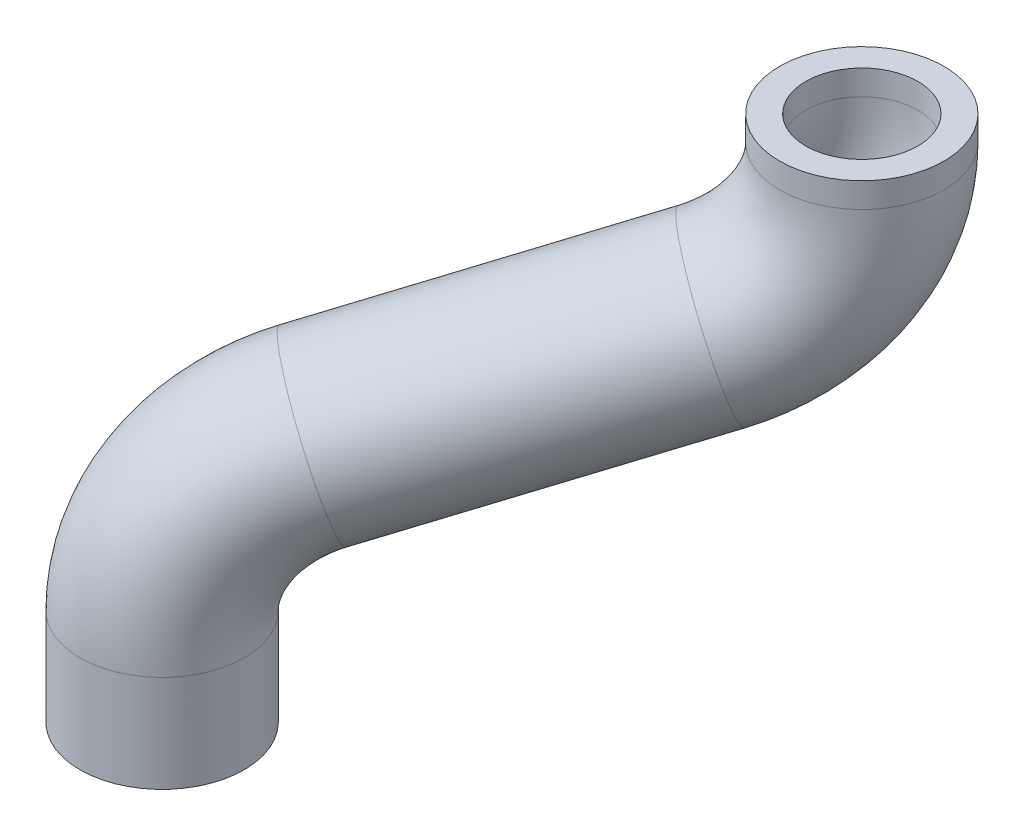
ISO-10303-21;
HEADER;
FILE_DESCRIPTION(('STEP AP214'),'2;1');
FILE_NAME('part.step','',(''),(''),'','','');
FILE_SCHEMA(('AUTOMOTIVE_DESIGN { 1 0 10303 214 1 1 1 1 }'));
ENDSEC;
DATA;
#1=APPLICATION_CONTEXT('core data for automotive mechanical design processes');
#2=APPLICATION_PROTOCOL_DEFINITION('international standard','automotive_design',2000,#1);
#3=PRODUCT_CONTEXT('',#1,'mechanical');
#4=PRODUCT('Part','Part','',(#3));
#5=PRODUCT_RELATED_PRODUCT_CATEGORY('part','',(#4));
#6=PRODUCT_DEFINITION_FORMATION('','',#4);
#7=PRODUCT_DEFINITION_CONTEXT('part definition',#1,'design');
#8=PRODUCT_DEFINITION('design','',#6,#7);
#9=PRODUCT_DEFINITION_SHAPE('','',#8);
#10=(LENGTH_UNIT() NAMED_UNIT(*) SI_UNIT(.MILLI.,.METRE.));
#11=(NAMED_UNIT(*) PLANE_ANGLE_UNIT() SI_UNIT($,.RADIAN.));
#12=(NAMED_UNIT(*) SI_UNIT($,.STERADIAN.) SOLID_ANGLE_UNIT());
#13=UNCERTAINTY_MEASURE_WITH_UNIT(LENGTH_MEASURE(1.E-05),#10,'distance_accuracy_value','');
#14=(GEOMETRIC_REPRESENTATION_CONTEXT(3) GLOBAL_UNCERTAINTY_ASSIGNED_CONTEXT((#13)) GLOBAL_UNIT_ASSIGNED_CONTEXT((#10,
#11,#12)) REPRESENTATION_CONTEXT('',''));
#15=CARTESIAN_POINT('',(0.,0.,0.));
#16=DIRECTION('',(0.,0.,1.));
#17=DIRECTION('',(1.,0.,0.));
#18=AXIS2_PLACEMENT_3D('',#15,#16,#17);
#19=CARTESIAN_POINT('',(-278.808582713209,47.6944504142142,105.885812846639));
#20=DIRECTION('',(0.,1.,0.));
#21=DIRECTION('',(0.,0.,1.));
#22=AXIS2_PLACEMENT_3D('',#19,#20,#21);
#23=CYLINDRICAL_SURFACE('',#22,11.);
#24=CARTESIAN_POINT('',(-278.808582713209,60.6776060962734,105.885812846639));
#25=DIRECTION('',(0.,1.,0.));
#26=DIRECTION('',(0.,0.,1.));
#27=AXIS2_PLACEMENT_3D('',#24,#25,#26);
#28=CIRCLE('',#27,11.);
#29=CARTESIAN_POINT('',(-285.951248603986,60.6776060962734,114.251356700611));
#30=VERTEX_POINT('',#29);
#31=EDGE_CURVE('E56',#30,#30,#28,.T.);
#32=ORIENTED_EDGE('',*,*,#31,.F.);
#33=EDGE_LOOP('',(#32));
#34=FACE_BOUND('',#33,.T.);
#35=CARTESIAN_POINT('',(-278.808582713209,47.6944504142142,105.885812846639));
#36=DIRECTION('',(0.,1.,0.));
#37=DIRECTION('',(0.,0.,1.));
#38=AXIS2_PLACEMENT_3D('',#35,#36,#37);
#39=CIRCLE('',#38,11.);
#40=CARTESIAN_POINT('',(-278.808582713209,47.6944504142142,116.885812846639));
#41=VERTEX_POINT('',#40);
#42=EDGE_CURVE('E53',#41,#41,#39,.T.);
#43=ORIENTED_EDGE('',*,*,#42,.T.);
#44=EDGE_LOOP('',(#43));
#45=FACE_BOUND('',#44,.T.);
#46=ADVANCED_FACE('F32',(#34,#45),#23,.T.);
#47=CARTESIAN_POINT('',(-265.614130813156,60.6776060962734,90.4323718363923));
#48=DIRECTION('',(-0.760503986724747,0.,-0.649333262797899));
#49=DIRECTION('',(-0.649333262797899,0.,0.760503986724747));
#50=AXIS2_PLACEMENT_3D('',#47,#48,#49);
#51=TOROIDAL_SURFACE('',#50,20.32,11.);
#52=CARTESIAN_POINT('',(-269.523012131986,80.0854381614537,95.0104829496204));
#53=DIRECTION('',(0.620184592456557,0.296251890449026,-0.72636484543573));
#54=DIRECTION('',(0.347525268013519,0.72636484543573,0.59297580001823));
#55=AXIS2_PLACEMENT_3D('',#52,#53,#54);
#56=CIRCLE('',#55,11.);
#57=CARTESIAN_POINT('',(-271.639040404974,90.5916464644549,97.4887911309939));
#58=VERTEX_POINT('',#57);
#59=EDGE_CURVE('E59',#58,#58,#56,.T.);
#60=CARTESIAN_POINT('',(-265.614130813156,60.6776060962734,90.4323718363923));
#61=DIRECTION('',(-0.760503986724747,0.,-0.649333262797899));
#62=DIRECTION('',(-0.649333262797899,0.,0.760503986724747));
#63=AXIS2_PLACEMENT_3D('',#60,#61,#62);
#64=CIRCLE('',#63,31.32);
#65=EDGE_CURVE('',#30,#58,#64,.T.);
#66=ORIENTED_EDGE('',*,*,#31,.T.);
#67=ORIENTED_EDGE('',*,*,#59,.F.);
#68=ORIENTED_EDGE('',*,*,#65,.T.);
#69=ORIENTED_EDGE('',*,*,#65,.F.);
#70=EDGE_LOOP('',(#66,#68,#67,#69));
#71=FACE_BOUND('',#70,.T.);
#72=ADVANCED_FACE('F78',(#71),#51,.T.);
#73=CARTESIAN_POINT('',(-269.523012131986,80.0854381614537,95.0104829496204));
#74=DIRECTION('',(0.620184592456559,0.296251890449025,-0.726364845435729));
#75=DIRECTION('',(-0.760503986724746,0.,-0.649333262797901));
#76=AXIS2_PLACEMENT_3D('',#73,#74,#75);
#77=CYLINDRICAL_SURFACE('',#76,11.);
#78=CARTESIAN_POINT('',(-244.950027579798,91.8235451962077,66.2304191698277));
#79=DIRECTION('',(0.620184592456559,0.296251890449025,-0.726364845435729));
#80=DIRECTION('',(0.347525268013519,0.72636484543573,0.59297580001823));
#81=AXIS2_PLACEMENT_3D('',#78,#79,#80);
#82=CIRCLE('',#81,11.);
#83=CARTESIAN_POINT('',(-242.833999306809,81.3173368932065,63.7521109884542));
#84=VERTEX_POINT('',#83);
#85=EDGE_CURVE('E61',#84,#84,#82,.T.);
#86=ORIENTED_EDGE('',*,*,#85,.F.);
#87=EDGE_LOOP('',(#86));
#88=FACE_BOUND('',#87,.T.);
#89=ORIENTED_EDGE('',*,*,#59,.T.);
#90=EDGE_LOOP('',(#89));
#91=FACE_BOUND('',#90,.T.);
#92=ADVANCED_FACE('F71',(#88,#91),#77,.T.);
#93=CARTESIAN_POINT('',(-248.858908898627,111.231377261388,70.8085302830558));
#94=DIRECTION('',(0.760503986724746,0.,0.649333262797901));
#95=DIRECTION('',(0.649333262797901,0.,-0.760503986724746));
#96=AXIS2_PLACEMENT_3D('',#93,#94,#95);
#97=TOROIDAL_SURFACE('',#96,20.32,11.);
#98=CARTESIAN_POINT('',(-235.664456998574,111.231377261388,55.3550892728094));
#99=DIRECTION('',(0.,1.,0.));
#100=DIRECTION('',(0.,0.,1.));
#101=AXIS2_PLACEMENT_3D('',#98,#99,#100);
#102=CIRCLE('',#101,11.);
#103=CARTESIAN_POINT('',(-228.521791107796,111.231377261388,46.9895454188372));
#104=VERTEX_POINT('',#103);
#105=EDGE_CURVE('E36',#104,#104,#102,.T.);
#106=CARTESIAN_POINT('',(-248.858908898627,111.231377261388,70.8085302830558));
#107=DIRECTION('',(0.760503986724746,0.,0.649333262797901));
#108=DIRECTION('',(0.649333262797901,0.,-0.760503986724746));
#109=AXIS2_PLACEMENT_3D('',#106,#107,#108);
#110=CIRCLE('',#109,31.32);
#111=EDGE_CURVE('',#84,#104,#110,.T.);
#112=ORIENTED_EDGE('',*,*,#85,.T.);
#113=ORIENTED_EDGE('',*,*,#105,.F.);
#114=ORIENTED_EDGE('',*,*,#111,.T.);
#115=ORIENTED_EDGE('',*,*,#111,.F.);
#116=EDGE_LOOP('',(#112,#114,#113,#115));
#117=FACE_BOUND('',#116,.T.);
#118=ADVANCED_FACE('F69',(#117),#97,.T.);
#119=CARTESIAN_POINT('',(-235.664456998574,111.231377261388,55.3550892728094));
#120=DIRECTION('',(0.,1.,0.));
#121=DIRECTION('',(0.,0.,1.));
#122=AXIS2_PLACEMENT_3D('',#119,#120,#121);
#123=CYLINDRICAL_SURFACE('',#122,11.);
#124=CARTESIAN_POINT('',(-235.664456998574,114.569170273835,55.3550892728094));
#125=DIRECTION('',(0.,1.,0.));
#126=DIRECTION('',(0.,0.,1.));
#127=AXIS2_PLACEMENT_3D('',#124,#125,#126);
#128=CIRCLE('',#127,11.);
#129=CARTESIAN_POINT('',(-235.664456998574,114.569170273835,66.3550892728094));
#130=VERTEX_POINT('',#129);
#131=EDGE_CURVE('E49',#130,#130,#128,.T.);
#132=ORIENTED_EDGE('',*,*,#131,.F.);
#133=EDGE_LOOP('',(#132));
#134=FACE_BOUND('',#133,.T.);
#135=ORIENTED_EDGE('',*,*,#105,.T.);
#136=EDGE_LOOP('',(#135));
#137=FACE_BOUND('',#136,.T.);
#138=ADVANCED_FACE('F34',(#134,#137),#123,.T.);
#139=CARTESIAN_POINT('',(-278.808582713209,47.6944504142142,105.885812846639));
#140=DIRECTION('',(0.,1.,0.));
#141=DIRECTION('',(0.,0.,1.));
#142=AXIS2_PLACEMENT_3D('',#139,#140,#141);
#143=PLANE('',#142);
#144=CARTESIAN_POINT('',(-278.808582713209,47.6944504142142,105.885812846639));
#145=DIRECTION('',(0.,1.,0.));
#146=DIRECTION('',(0.,0.,1.));
#147=AXIS2_PLACEMENT_3D('',#144,#145,#146);
#148=CIRCLE('',#147,7.50000000000001);
#149=CARTESIAN_POINT('',(-278.808582713209,47.6944504142142,113.385812846639));
#150=VERTEX_POINT('',#149);
#151=EDGE_CURVE('E52',#150,#150,#148,.F.);
#152=ORIENTED_EDGE('',*,*,#151,.F.);
#153=EDGE_LOOP('',(#152));
#154=FACE_BOUND('',#153,.T.);
#155=ORIENTED_EDGE('',*,*,#42,.F.);
#156=EDGE_LOOP('',(#155));
#157=FACE_BOUND('',#156,.T.);
#158=ADVANCED_FACE('F76',(#154,#157),#143,.F.);
#159=CARTESIAN_POINT('',(-235.664456998574,114.569170273835,55.3550892728094));
#160=DIRECTION('',(0.,1.,0.));
#161=DIRECTION('',(0.,0.,1.));
#162=AXIS2_PLACEMENT_3D('',#159,#160,#161);
#163=PLANE('',#162);
#164=CARTESIAN_POINT('',(-235.664456998574,114.569170273835,55.3550892728094));
#165=DIRECTION('',(0.,1.,0.));
#166=DIRECTION('',(0.,0.,1.));
#167=AXIS2_PLACEMENT_3D('',#164,#165,#166);
#168=CIRCLE('',#167,7.50000000000001);
#169=CARTESIAN_POINT('',(-235.664456998574,114.569170273835,62.8550892728094));
#170=VERTEX_POINT('',#169);
#171=EDGE_CURVE('E10',#170,#170,#168,.F.);
#172=ORIENTED_EDGE('',*,*,#171,.T.);
#173=EDGE_LOOP('',(#172));
#174=FACE_BOUND('',#173,.T.);
#175=ORIENTED_EDGE('',*,*,#131,.T.);
#176=EDGE_LOOP('',(#175));
#177=FACE_BOUND('',#176,.T.);
#178=ADVANCED_FACE('F95',(#174,#177),#163,.T.);
#179=CARTESIAN_POINT('',(-278.808582713209,47.6944504142142,105.885812846639));
#180=DIRECTION('',(0.,1.,0.));
#181=DIRECTION('',(0.,0.,1.));
#182=AXIS2_PLACEMENT_3D('',#179,#180,#181);
#183=CYLINDRICAL_SURFACE('',#182,7.50000000000001);
#184=CARTESIAN_POINT('',(-278.808582713209,60.6776060962734,105.885812846639));
#185=DIRECTION('',(0.,1.,0.));
#186=DIRECTION('',(0.,0.,1.));
#187=AXIS2_PLACEMENT_3D('',#184,#185,#186);
#188=CIRCLE('',#187,7.50000000000001);
#189=CARTESIAN_POINT('',(-283.678582184194,60.6776060962734,111.589592747075));
#190=VERTEX_POINT('',#189);
#191=EDGE_CURVE('E191',#190,#190,#188,.F.);
#192=ORIENTED_EDGE('',*,*,#191,.F.);
#193=EDGE_LOOP('',(#192));
#194=FACE_BOUND('',#193,.T.);
#195=ORIENTED_EDGE('',*,*,#151,.T.);
#196=EDGE_LOOP('',(#195));
#197=FACE_BOUND('',#196,.T.);
#198=ADVANCED_FACE('F98',(#194,#197),#183,.F.);
#199=CARTESIAN_POINT('',(-265.614130813156,60.6776060962734,90.4323718363923));
#200=DIRECTION('',(-0.760503986724747,0.,-0.649333262797899));
#201=DIRECTION('',(-0.649333262797899,0.,0.760503986724747));
#202=AXIS2_PLACEMENT_3D('',#199,#200,#201);
#203=TOROIDAL_SURFACE('',#202,20.32,7.50000000000001);
#204=CARTESIAN_POINT('',(-269.523012131986,80.0854381614537,95.0104829496204));
#205=DIRECTION('',(0.620184592456557,0.296251890449026,-0.72636484543573));
#206=DIRECTION('',(0.347525268013519,0.72636484543573,0.59297580001823));
#207=AXIS2_PLACEMENT_3D('',#204,#205,#206);
#208=CIRCLE('',#207,7.50000000000001);
#209=CARTESIAN_POINT('',(-270.96575868175,87.2487620044091,96.7002385278297));
#210=VERTEX_POINT('',#209);
#211=EDGE_CURVE('E190',#210,#210,#208,.F.);
#212=CARTESIAN_POINT('',(-265.614130813156,60.6776060962734,90.4323718363923));
#213=DIRECTION('',(-0.760503986724747,0.,-0.649333262797899));
#214=DIRECTION('',(-0.649333262797899,0.,0.760503986724747));
#215=AXIS2_PLACEMENT_3D('',#212,#213,#214);
#216=CIRCLE('',#215,27.82);
#217=EDGE_CURVE('',#190,#210,#216,.T.);
#218=ORIENTED_EDGE('',*,*,#191,.T.);
#219=ORIENTED_EDGE('',*,*,#211,.F.);
#220=ORIENTED_EDGE('',*,*,#217,.T.);
#221=ORIENTED_EDGE('',*,*,#217,.F.);
#222=EDGE_LOOP('',(#218,#220,#219,#221));
#223=FACE_BOUND('',#222,.T.);
#224=ADVANCED_FACE('F153',(#223),#203,.F.);
#225=CARTESIAN_POINT('',(-269.523012131986,80.0854381614537,95.0104829496204));
#226=DIRECTION('',(0.620184592456559,0.296251890449025,-0.726364845435729));
#227=DIRECTION('',(-0.760503986724746,0.,-0.649333262797901));
#228=AXIS2_PLACEMENT_3D('',#225,#226,#227);
#229=CYLINDRICAL_SURFACE('',#228,7.50000000000001);
#230=CARTESIAN_POINT('',(-244.950027579798,91.8235451962077,66.2304191698277));
#231=DIRECTION('',(0.620184592456559,0.296251890449025,-0.726364845435729));
#232=DIRECTION('',(0.347525268013519,0.72636484543573,0.59297580001823));
#233=AXIS2_PLACEMENT_3D('',#230,#231,#232);
#234=CIRCLE('',#233,7.50000000000001);
#235=CARTESIAN_POINT('',(-243.507281030033,84.6602213532523,64.5406635916185));
#236=VERTEX_POINT('',#235);
#237=EDGE_CURVE('E45',#236,#236,#234,.F.);
#238=ORIENTED_EDGE('',*,*,#237,.F.);
#239=EDGE_LOOP('',(#238));
#240=FACE_BOUND('',#239,.T.);
#241=ORIENTED_EDGE('',*,*,#211,.T.);
#242=EDGE_LOOP('',(#241));
#243=FACE_BOUND('',#242,.T.);
#244=ADVANCED_FACE('F89',(#240,#243),#229,.F.);
#245=CARTESIAN_POINT('',(-248.858908898627,111.231377261388,70.8085302830558));
#246=DIRECTION('',(0.760503986724746,0.,0.649333262797901));
#247=DIRECTION('',(0.649333262797901,0.,-0.760503986724746));
#248=AXIS2_PLACEMENT_3D('',#245,#246,#247);
#249=TOROIDAL_SURFACE('',#248,20.32,7.50000000000001);
#250=CARTESIAN_POINT('',(-235.664456998574,111.231377261388,55.3550892728094));
#251=DIRECTION('',(0.,1.,0.));
#252=DIRECTION('',(0.,0.,1.));
#253=AXIS2_PLACEMENT_3D('',#250,#251,#252);
#254=CIRCLE('',#253,7.50000000000001);
#255=CARTESIAN_POINT('',(-230.794457527589,111.231377261388,49.6513093723738));
#256=VERTEX_POINT('',#255);
#257=EDGE_CURVE('E40',#256,#256,#254,.F.);
#258=CARTESIAN_POINT('',(-248.858908898627,111.231377261388,70.8085302830558));
#259=DIRECTION('',(0.760503986724746,0.,0.649333262797901));
#260=DIRECTION('',(0.649333262797901,0.,-0.760503986724746));
#261=AXIS2_PLACEMENT_3D('',#258,#259,#260);
#262=CIRCLE('',#261,27.82);
#263=EDGE_CURVE('',#236,#256,#262,.T.);
#264=ORIENTED_EDGE('',*,*,#237,.T.);
#265=ORIENTED_EDGE('',*,*,#257,.F.);
#266=ORIENTED_EDGE('',*,*,#263,.T.);
#267=ORIENTED_EDGE('',*,*,#263,.F.);
#268=EDGE_LOOP('',(#264,#266,#265,#267));
#269=FACE_BOUND('',#268,.T.);
#270=ADVANCED_FACE('F83',(#269),#249,.F.);
#271=CARTESIAN_POINT('',(-235.664456998574,111.231377261388,55.3550892728094));
#272=DIRECTION('',(0.,1.,0.));
#273=DIRECTION('',(0.,0.,1.));
#274=AXIS2_PLACEMENT_3D('',#271,#272,#273);
#275=CYLINDRICAL_SURFACE('',#274,7.50000000000001);
#276=ORIENTED_EDGE('',*,*,#171,.F.);
#277=EDGE_LOOP('',(#276));
#278=FACE_BOUND('',#277,.T.);
#279=ORIENTED_EDGE('',*,*,#257,.T.);
#280=EDGE_LOOP('',(#279));
#281=FACE_BOUND('',#280,.T.);
#282=ADVANCED_FACE('F81',(#278,#281),#275,.F.);
#283=CLOSED_SHELL('',(#46,#72,#92,#118,#138,#158,#178,#198,#224,#244,#270,#282));
#284=MANIFOLD_SOLID_BREP('B2',#283);
#285=ADVANCED_BREP_SHAPE_REPRESENTATION('',(#18,#284),#14);
#286=SHAPE_DEFINITION_REPRESENTATION(#9,#285);
ENDSEC;
END-ISO-10303-21;
